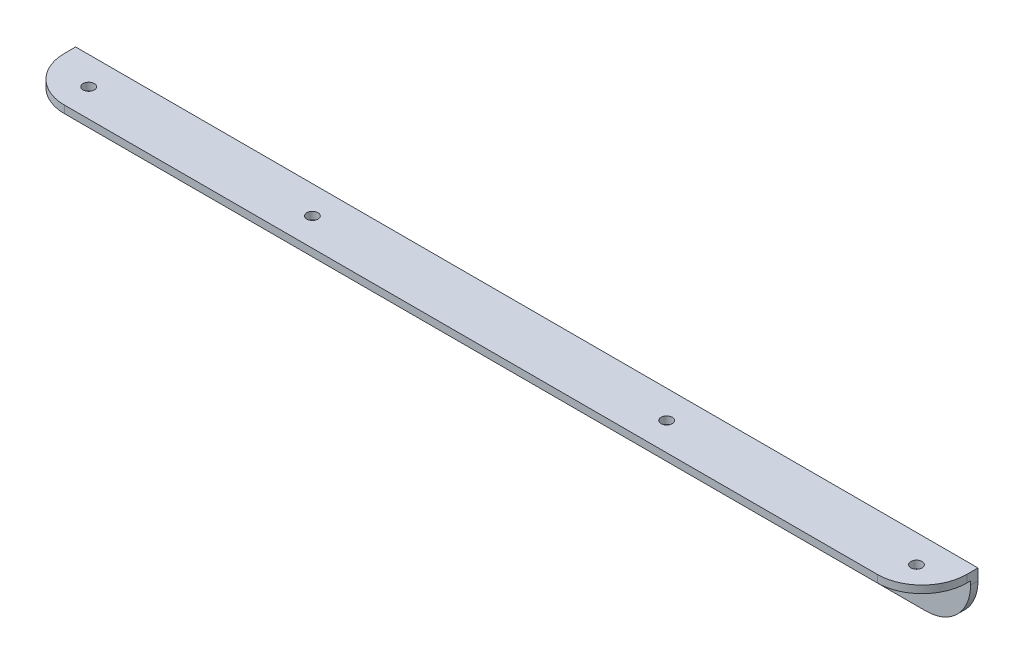
ISO-10303-21;
HEADER;
FILE_DESCRIPTION(('STEP AP214'),'2;1');
FILE_NAME('part.step','',(''),(''),'','','');
FILE_SCHEMA(('AUTOMOTIVE_DESIGN { 1 0 10303 214 1 1 1 1 }'));
ENDSEC;
DATA;
#1=APPLICATION_CONTEXT('core data for automotive mechanical design processes');
#2=APPLICATION_PROTOCOL_DEFINITION('international standard','automotive_design',2000,#1);
#3=PRODUCT_CONTEXT('',#1,'mechanical');
#4=PRODUCT('Part','Part','',(#3));
#5=PRODUCT_RELATED_PRODUCT_CATEGORY('part','',(#4));
#6=PRODUCT_DEFINITION_FORMATION('','',#4);
#7=PRODUCT_DEFINITION_CONTEXT('part definition',#1,'design');
#8=PRODUCT_DEFINITION('design','',#6,#7);
#9=PRODUCT_DEFINITION_SHAPE('','',#8);
#10=(LENGTH_UNIT() NAMED_UNIT(*) SI_UNIT(.MILLI.,.METRE.));
#11=(NAMED_UNIT(*) PLANE_ANGLE_UNIT() SI_UNIT($,.RADIAN.));
#12=(NAMED_UNIT(*) SI_UNIT($,.STERADIAN.) SOLID_ANGLE_UNIT());
#13=UNCERTAINTY_MEASURE_WITH_UNIT(LENGTH_MEASURE(1.E-05),#10,'distance_accuracy_value','');
#14=(GEOMETRIC_REPRESENTATION_CONTEXT(3) GLOBAL_UNCERTAINTY_ASSIGNED_CONTEXT((#13)) GLOBAL_UNIT_ASSIGNED_CONTEXT((#10,
#11,#12)) REPRESENTATION_CONTEXT('',''));
#15=CARTESIAN_POINT('',(0.,0.,0.));
#16=DIRECTION('',(0.,0.,1.));
#17=DIRECTION('',(1.,0.,0.));
#18=AXIS2_PLACEMENT_3D('',#15,#16,#17);
#19=CARTESIAN_POINT('',(-121.,-13.,2.));
#20=DIRECTION('',(0.,1.,0.));
#21=DIRECTION('',(-1.,0.,0.));
#22=AXIS2_PLACEMENT_3D('',#19,#20,#21);
#23=PLANE('',#22);
#24=DIRECTION('',(1.,0.,0.));
#25=VECTOR('',#24,1.);
#26=CARTESIAN_POINT('',(-121.,-13.,2.));
#27=LINE('',#26,#25);
#28=CARTESIAN_POINT('',(-109.,-13.,2.));
#29=VERTEX_POINT('',#28);
#30=CARTESIAN_POINT('',(-18.,-13.,2.));
#31=VERTEX_POINT('',#30);
#32=EDGE_CURVE('E247',#29,#31,#27,.T.);
#33=ORIENTED_EDGE('',*,*,#32,.F.);
#34=DIRECTION('',(0.,0.,-1.));
#35=VECTOR('',#34,1.);
#36=CARTESIAN_POINT('',(-109.,-13.,2.));
#37=LINE('',#36,#35);
#38=CARTESIAN_POINT('',(-109.,-13.,0.));
#39=VERTEX_POINT('',#38);
#40=EDGE_CURVE('E248',#29,#39,#37,.T.);
#41=ORIENTED_EDGE('',*,*,#40,.T.);
#42=DIRECTION('',(1.,0.,0.));
#43=VECTOR('',#42,1.);
#44=CARTESIAN_POINT('',(-121.,-13.,0.));
#45=LINE('',#44,#43);
#46=CARTESIAN_POINT('',(-18.,-13.,0.));
#47=VERTEX_POINT('',#46);
#48=EDGE_CURVE('E240',#39,#47,#45,.T.);
#49=ORIENTED_EDGE('',*,*,#48,.T.);
#50=DIRECTION('',(0.,0.,1.));
#51=VECTOR('',#50,1.);
#52=CARTESIAN_POINT('',(-18.,-13.,-0.00100000000000013));
#53=LINE('',#52,#51);
#54=EDGE_CURVE('E197',#47,#31,#53,.T.);
#55=ORIENTED_EDGE('',*,*,#54,.T.);
#56=EDGE_LOOP('',(#33,#41,#49,#55));
#57=FACE_BOUND('',#56,.T.);
#58=ADVANCED_FACE('F39',(#57),#23,.F.);
#59=CARTESIAN_POINT('',(0.,0.,2.));
#60=DIRECTION('',(0.,0.,1.));
#61=DIRECTION('',(1.,0.,0.));
#62=AXIS2_PLACEMENT_3D('',#59,#60,#61);
#63=PLANE('',#62);
#64=DIRECTION('',(0.,-1.,0.));
#65=VECTOR('',#64,1.);
#66=CARTESIAN_POINT('',(-121.,0.,2.));
#67=LINE('',#66,#65);
#68=CARTESIAN_POINT('',(-121.,0.,2.));
#69=VERTEX_POINT('',#68);
#70=CARTESIAN_POINT('',(-121.,-0.999999999999997,2.));
#71=VERTEX_POINT('',#70);
#72=EDGE_CURVE('E243',#69,#71,#67,.T.);
#73=ORIENTED_EDGE('',*,*,#72,.T.);
#74=CARTESIAN_POINT('',(-109.,-0.999999999999997,2.));
#75=DIRECTION('',(0.,0.,1.));
#76=DIRECTION('',(1.,0.,0.));
#77=AXIS2_PLACEMENT_3D('',#74,#75,#76);
#78=CIRCLE('',#77,12.);
#79=EDGE_CURVE('E265',#71,#29,#78,.T.);
#80=ORIENTED_EDGE('',*,*,#79,.T.);
#81=ORIENTED_EDGE('',*,*,#32,.T.);
#82=DIRECTION('',(0.,-1.,0.));
#83=VECTOR('',#82,1.);
#84=CARTESIAN_POINT('',(-18.,-9.00000000000001,2.));
#85=LINE('',#84,#83);
#86=CARTESIAN_POINT('',(-18.,-9.00000000000001,2.));
#87=VERTEX_POINT('',#86);
#88=EDGE_CURVE('E193',#87,#31,#85,.T.);
#89=ORIENTED_EDGE('',*,*,#88,.F.);
#90=DIRECTION('',(-1.,0.,0.));
#91=VECTOR('',#90,1.);
#92=CARTESIAN_POINT('',(12.,-9.00000000000001,2.));
#93=LINE('',#92,#91);
#94=CARTESIAN_POINT('',(12.,-9.00000000000001,2.));
#95=VERTEX_POINT('',#94);
#96=EDGE_CURVE('E190',#95,#87,#93,.T.);
#97=ORIENTED_EDGE('',*,*,#96,.F.);
#98=DIRECTION('',(0.,1.,0.));
#99=VECTOR('',#98,1.);
#100=CARTESIAN_POINT('',(12.,-13.,2.));
#101=LINE('',#100,#99);
#102=CARTESIAN_POINT('',(12.,-13.,2.));
#103=VERTEX_POINT('',#102);
#104=EDGE_CURVE('E187',#103,#95,#101,.T.);
#105=ORIENTED_EDGE('',*,*,#104,.F.);
#106=CARTESIAN_POINT('',(109.,-13.,2.));
#107=VERTEX_POINT('',#106);
#108=EDGE_CURVE('E246',#103,#107,#27,.T.);
#109=ORIENTED_EDGE('',*,*,#108,.T.);
#110=CARTESIAN_POINT('',(109.,-0.999999999999956,2.));
#111=DIRECTION('',(0.,0.,1.));
#112=DIRECTION('',(1.,0.,0.));
#113=AXIS2_PLACEMENT_3D('',#110,#111,#112);
#114=CIRCLE('',#113,12.);
#115=CARTESIAN_POINT('',(121.,-0.999999999999943,2.));
#116=VERTEX_POINT('',#115);
#117=EDGE_CURVE('E263',#107,#116,#114,.T.);
#118=ORIENTED_EDGE('',*,*,#117,.T.);
#119=DIRECTION('',(0.,1.,0.));
#120=VECTOR('',#119,1.);
#121=CARTESIAN_POINT('',(121.,0.,2.));
#122=LINE('',#121,#120);
#123=CARTESIAN_POINT('',(121.,0.,2.));
#124=VERTEX_POINT('',#123);
#125=EDGE_CURVE('E236',#116,#124,#122,.T.);
#126=ORIENTED_EDGE('',*,*,#125,.T.);
#127=DIRECTION('',(-1.,0.,0.));
#128=VECTOR('',#127,1.);
#129=CARTESIAN_POINT('',(-121.,0.,2.));
#130=LINE('',#129,#128);
#131=EDGE_CURVE('E239',#124,#69,#130,.T.);
#132=ORIENTED_EDGE('',*,*,#131,.T.);
#133=EDGE_LOOP('',(#73,#80,#81,#89,#97,#105,#109,#118,#126,#132));
#134=FACE_BOUND('',#133,.T.);
#135=CARTESIAN_POINT('',(27.,-6.5,2.));
#136=DIRECTION('',(0.,0.,1.));
#137=DIRECTION('',(1.,0.,0.));
#138=AXIS2_PLACEMENT_3D('',#135,#136,#137);
#139=CIRCLE('',#138,1.5);
#140=CARTESIAN_POINT('',(28.5,-6.5,2.));
#141=VERTEX_POINT('',#140);
#142=EDGE_CURVE('E214',#141,#141,#139,.T.);
#143=ORIENTED_EDGE('',*,*,#142,.F.);
#144=EDGE_LOOP('',(#143));
#145=FACE_BOUND('',#144,.T.);
#146=CARTESIAN_POINT('',(-44.,-6.5,2.));
#147=DIRECTION('',(0.,0.,1.));
#148=DIRECTION('',(1.,0.,0.));
#149=AXIS2_PLACEMENT_3D('',#146,#147,#148);
#150=CIRCLE('',#149,1.5);
#151=CARTESIAN_POINT('',(-42.5,-6.5,2.));
#152=VERTEX_POINT('',#151);
#153=EDGE_CURVE('E226',#152,#152,#150,.T.);
#154=ORIENTED_EDGE('',*,*,#153,.F.);
#155=EDGE_LOOP('',(#154));
#156=FACE_BOUND('',#155,.T.);
#157=CARTESIAN_POINT('',(-114.,-6.5,2.));
#158=DIRECTION('',(0.,0.,1.));
#159=DIRECTION('',(1.,0.,0.));
#160=AXIS2_PLACEMENT_3D('',#157,#158,#159);
#161=CIRCLE('',#160,1.5);
#162=CARTESIAN_POINT('',(-112.5,-6.5,2.));
#163=VERTEX_POINT('',#162);
#164=EDGE_CURVE('E159',#163,#163,#161,.T.);
#165=ORIENTED_EDGE('',*,*,#164,.F.);
#166=EDGE_LOOP('',(#165));
#167=FACE_BOUND('',#166,.T.);
#168=CARTESIAN_POINT('',(-24.,-6.5,2.));
#169=DIRECTION('',(0.,0.,1.));
#170=DIRECTION('',(1.,0.,0.));
#171=AXIS2_PLACEMENT_3D('',#168,#169,#170);
#172=CIRCLE('',#171,1.5);
#173=CARTESIAN_POINT('',(-22.5,-6.5,2.));
#174=VERTEX_POINT('',#173);
#175=EDGE_CURVE('E220',#174,#174,#172,.T.);
#176=ORIENTED_EDGE('',*,*,#175,.F.);
#177=EDGE_LOOP('',(#176));
#178=FACE_BOUND('',#177,.T.);
#179=CARTESIAN_POINT('',(97.,-6.5,2.));
#180=DIRECTION('',(0.,0.,1.));
#181=DIRECTION('',(1.,0.,0.));
#182=AXIS2_PLACEMENT_3D('',#179,#180,#181);
#183=CIRCLE('',#182,1.5);
#184=CARTESIAN_POINT('',(98.5,-6.5,2.));
#185=VERTEX_POINT('',#184);
#186=EDGE_CURVE('E208',#185,#185,#183,.T.);
#187=ORIENTED_EDGE('',*,*,#186,.F.);
#188=EDGE_LOOP('',(#187));
#189=FACE_BOUND('',#188,.T.);
#190=ADVANCED_FACE('F295',(#134,#145,#156,#167,#178,#189),#63,.T.);
#191=CARTESIAN_POINT('',(0.,0.,0.));
#192=DIRECTION('',(0.,0.,1.));
#193=DIRECTION('',(1.,0.,0.));
#194=AXIS2_PLACEMENT_3D('',#191,#192,#193);
#195=PLANE('',#194);
#196=ORIENTED_EDGE('',*,*,#48,.F.);
#197=CARTESIAN_POINT('',(-109.,-0.999999999999997,0.));
#198=DIRECTION('',(0.,0.,1.));
#199=DIRECTION('',(1.,0.,0.));
#200=AXIS2_PLACEMENT_3D('',#197,#198,#199);
#201=CIRCLE('',#200,12.);
#202=CARTESIAN_POINT('',(-121.,-0.999999999999997,0.));
#203=VERTEX_POINT('',#202);
#204=EDGE_CURVE('E257',#39,#203,#201,.F.);
#205=ORIENTED_EDGE('',*,*,#204,.T.);
#206=DIRECTION('',(0.,-1.,0.));
#207=VECTOR('',#206,1.);
#208=CARTESIAN_POINT('',(-121.,0.,0.));
#209=LINE('',#208,#207);
#210=CARTESIAN_POINT('',(-121.,2.00000000000004,0.));
#211=VERTEX_POINT('',#210);
#212=EDGE_CURVE('E158',#211,#203,#209,.T.);
#213=ORIENTED_EDGE('',*,*,#212,.F.);
#214=DIRECTION('',(-1.,0.,0.));
#215=VECTOR('',#214,1.);
#216=CARTESIAN_POINT('',(-121.,2.00000000000004,0.));
#217=LINE('',#216,#215);
#218=CARTESIAN_POINT('',(121.,2.00000000000004,0.));
#219=VERTEX_POINT('',#218);
#220=EDGE_CURVE('E145',#219,#211,#217,.T.);
#221=ORIENTED_EDGE('',*,*,#220,.F.);
#222=DIRECTION('',(0.,1.,0.));
#223=VECTOR('',#222,1.);
#224=CARTESIAN_POINT('',(121.,0.,0.));
#225=LINE('',#224,#223);
#226=CARTESIAN_POINT('',(121.,-0.999999999999943,0.));
#227=VERTEX_POINT('',#226);
#228=EDGE_CURVE('E152',#227,#219,#225,.T.);
#229=ORIENTED_EDGE('',*,*,#228,.F.);
#230=CARTESIAN_POINT('',(109.,-0.999999999999956,0.));
#231=DIRECTION('',(0.,0.,1.));
#232=DIRECTION('',(1.,0.,0.));
#233=AXIS2_PLACEMENT_3D('',#230,#231,#232);
#234=CIRCLE('',#233,12.);
#235=CARTESIAN_POINT('',(109.,-13.,0.));
#236=VERTEX_POINT('',#235);
#237=EDGE_CURVE('E255',#227,#236,#234,.F.);
#238=ORIENTED_EDGE('',*,*,#237,.T.);
#239=CARTESIAN_POINT('',(12.,-13.,0.));
#240=VERTEX_POINT('',#239);
#241=EDGE_CURVE('E251',#240,#236,#45,.T.);
#242=ORIENTED_EDGE('',*,*,#241,.F.);
#243=DIRECTION('',(0.,-1.,0.));
#244=VECTOR('',#243,1.);
#245=CARTESIAN_POINT('',(12.,-13.,0.));
#246=LINE('',#245,#244);
#247=CARTESIAN_POINT('',(12.,-9.00000000000001,0.));
#248=VERTEX_POINT('',#247);
#249=EDGE_CURVE('E200',#248,#240,#246,.T.);
#250=ORIENTED_EDGE('',*,*,#249,.F.);
#251=DIRECTION('',(1.,0.,0.));
#252=VECTOR('',#251,1.);
#253=CARTESIAN_POINT('',(12.,-9.00000000000001,0.));
#254=LINE('',#253,#252);
#255=CARTESIAN_POINT('',(-18.,-9.00000000000001,0.));
#256=VERTEX_POINT('',#255);
#257=EDGE_CURVE('E181',#256,#248,#254,.T.);
#258=ORIENTED_EDGE('',*,*,#257,.F.);
#259=DIRECTION('',(0.,1.,0.));
#260=VECTOR('',#259,1.);
#261=CARTESIAN_POINT('',(-18.,-9.00000000000001,0.));
#262=LINE('',#261,#260);
#263=EDGE_CURVE('E184',#47,#256,#262,.T.);
#264=ORIENTED_EDGE('',*,*,#263,.F.);
#265=EDGE_LOOP('',(#196,#205,#213,#221,#229,#238,#242,#250,#258,#264));
#266=FACE_BOUND('',#265,.T.);
#267=CARTESIAN_POINT('',(-114.,-6.5,0.));
#268=DIRECTION('',(0.,0.,1.));
#269=DIRECTION('',(1.,0.,0.));
#270=AXIS2_PLACEMENT_3D('',#267,#268,#269);
#271=CIRCLE('',#270,1.5);
#272=CARTESIAN_POINT('',(-112.5,-6.5,0.));
#273=VERTEX_POINT('',#272);
#274=EDGE_CURVE('E229',#273,#273,#271,.T.);
#275=ORIENTED_EDGE('',*,*,#274,.T.);
#276=EDGE_LOOP('',(#275));
#277=FACE_BOUND('',#276,.T.);
#278=CARTESIAN_POINT('',(-44.,-6.5,0.));
#279=DIRECTION('',(0.,0.,1.));
#280=DIRECTION('',(1.,0.,0.));
#281=AXIS2_PLACEMENT_3D('',#278,#279,#280);
#282=CIRCLE('',#281,1.5);
#283=CARTESIAN_POINT('',(-42.5,-6.5,0.));
#284=VERTEX_POINT('',#283);
#285=EDGE_CURVE('E223',#284,#284,#282,.T.);
#286=ORIENTED_EDGE('',*,*,#285,.T.);
#287=EDGE_LOOP('',(#286));
#288=FACE_BOUND('',#287,.T.);
#289=CARTESIAN_POINT('',(-24.,-6.5,0.));
#290=DIRECTION('',(0.,0.,1.));
#291=DIRECTION('',(1.,0.,0.));
#292=AXIS2_PLACEMENT_3D('',#289,#290,#291);
#293=CIRCLE('',#292,1.5);
#294=CARTESIAN_POINT('',(-22.5,-6.5,0.));
#295=VERTEX_POINT('',#294);
#296=EDGE_CURVE('E217',#295,#295,#293,.T.);
#297=ORIENTED_EDGE('',*,*,#296,.T.);
#298=EDGE_LOOP('',(#297));
#299=FACE_BOUND('',#298,.T.);
#300=CARTESIAN_POINT('',(27.,-6.5,0.));
#301=DIRECTION('',(0.,0.,1.));
#302=DIRECTION('',(1.,0.,0.));
#303=AXIS2_PLACEMENT_3D('',#300,#301,#302);
#304=CIRCLE('',#303,1.5);
#305=CARTESIAN_POINT('',(28.5,-6.5,0.));
#306=VERTEX_POINT('',#305);
#307=EDGE_CURVE('E211',#306,#306,#304,.T.);
#308=ORIENTED_EDGE('',*,*,#307,.T.);
#309=EDGE_LOOP('',(#308));
#310=FACE_BOUND('',#309,.T.);
#311=CARTESIAN_POINT('',(97.,-6.5,0.));
#312=DIRECTION('',(0.,0.,1.));
#313=DIRECTION('',(1.,0.,0.));
#314=AXIS2_PLACEMENT_3D('',#311,#312,#313);
#315=CIRCLE('',#314,1.5);
#316=CARTESIAN_POINT('',(98.5,-6.5,0.));
#317=VERTEX_POINT('',#316);
#318=EDGE_CURVE('E207',#317,#317,#315,.T.);
#319=ORIENTED_EDGE('',*,*,#318,.T.);
#320=EDGE_LOOP('',(#319));
#321=FACE_BOUND('',#320,.T.);
#322=ADVANCED_FACE('F163',(#266,#277,#288,#299,#310,#321),#195,.F.);
#323=CARTESIAN_POINT('',(121.,0.,2.));
#324=DIRECTION('',(-1.,0.,0.));
#325=DIRECTION('',(0.,-1.,0.));
#326=AXIS2_PLACEMENT_3D('',#323,#324,#325);
#327=PLANE('',#326);
#328=ORIENTED_EDGE('',*,*,#125,.F.);
#329=DIRECTION('',(0.,0.,-1.));
#330=VECTOR('',#329,1.);
#331=CARTESIAN_POINT('',(121.,-0.999999999999943,2.));
#332=LINE('',#331,#330);
#333=EDGE_CURVE('E156',#116,#227,#332,.T.);
#334=ORIENTED_EDGE('',*,*,#333,.T.);
#335=ORIENTED_EDGE('',*,*,#228,.T.);
#336=DIRECTION('',(0.,0.,-1.));
#337=VECTOR('',#336,1.);
#338=CARTESIAN_POINT('',(121.,2.00000000000004,15.));
#339=LINE('',#338,#337);
#340=CARTESIAN_POINT('',(121.,2.00000000000004,3.));
#341=VERTEX_POINT('',#340);
#342=EDGE_CURVE('E141',#341,#219,#339,.T.);
#343=ORIENTED_EDGE('',*,*,#342,.F.);
#344=DIRECTION('',(0.,1.,0.));
#345=VECTOR('',#344,1.);
#346=CARTESIAN_POINT('',(121.,0.,3.));
#347=LINE('',#346,#345);
#348=CARTESIAN_POINT('',(121.,0.,3.));
#349=VERTEX_POINT('',#348);
#350=EDGE_CURVE('E267',#341,#349,#347,.F.);
#351=ORIENTED_EDGE('',*,*,#350,.T.);
#352=DIRECTION('',(0.,0.,-1.));
#353=VECTOR('',#352,1.);
#354=CARTESIAN_POINT('',(121.,0.,15.));
#355=LINE('',#354,#353);
#356=EDGE_CURVE('E147',#349,#124,#355,.T.);
#357=ORIENTED_EDGE('',*,*,#356,.T.);
#358=EDGE_LOOP('',(#328,#334,#335,#343,#351,#357));
#359=FACE_BOUND('',#358,.T.);
#360=ADVANCED_FACE('F154',(#359),#327,.F.);
#361=CARTESIAN_POINT('',(-121.,0.,2.));
#362=DIRECTION('',(1.,0.,0.));
#363=DIRECTION('',(0.,0.,-1.));
#364=AXIS2_PLACEMENT_3D('',#361,#362,#363);
#365=PLANE('',#364);
#366=ORIENTED_EDGE('',*,*,#212,.T.);
#367=DIRECTION('',(0.,0.,-1.));
#368=VECTOR('',#367,1.);
#369=CARTESIAN_POINT('',(-121.,-0.999999999999997,2.));
#370=LINE('',#369,#368);
#371=EDGE_CURVE('E261',#203,#71,#370,.F.);
#372=ORIENTED_EDGE('',*,*,#371,.T.);
#373=ORIENTED_EDGE('',*,*,#72,.F.);
#374=DIRECTION('',(0.,0.,-1.));
#375=VECTOR('',#374,1.);
#376=CARTESIAN_POINT('',(-121.,0.,15.));
#377=LINE('',#376,#375);
#378=CARTESIAN_POINT('',(-121.,0.,3.));
#379=VERTEX_POINT('',#378);
#380=EDGE_CURVE('E179',#379,#69,#377,.T.);
#381=ORIENTED_EDGE('',*,*,#380,.F.);
#382=DIRECTION('',(0.,-1.,0.));
#383=VECTOR('',#382,1.);
#384=CARTESIAN_POINT('',(-121.,0.,3.));
#385=LINE('',#384,#383);
#386=CARTESIAN_POINT('',(-121.,2.00000000000004,3.));
#387=VERTEX_POINT('',#386);
#388=EDGE_CURVE('E259',#379,#387,#385,.F.);
#389=ORIENTED_EDGE('',*,*,#388,.T.);
#390=DIRECTION('',(0.,0.,-1.));
#391=VECTOR('',#390,1.);
#392=CARTESIAN_POINT('',(-121.,2.00000000000004,15.));
#393=LINE('',#392,#391);
#394=EDGE_CURVE('E148',#387,#211,#393,.T.);
#395=ORIENTED_EDGE('',*,*,#394,.T.);
#396=EDGE_LOOP('',(#366,#372,#373,#381,#389,#395));
#397=FACE_BOUND('',#396,.T.);
#398=ADVANCED_FACE('F289',(#397),#365,.F.);
#399=ORIENTED_EDGE('',*,*,#241,.T.);
#400=DIRECTION('',(0.,0.,-1.));
#401=VECTOR('',#400,1.);
#402=CARTESIAN_POINT('',(109.,-13.,2.));
#403=LINE('',#402,#401);
#404=EDGE_CURVE('E270',#236,#107,#403,.F.);
#405=ORIENTED_EDGE('',*,*,#404,.T.);
#406=ORIENTED_EDGE('',*,*,#108,.F.);
#407=DIRECTION('',(0.,0.,1.));
#408=VECTOR('',#407,1.);
#409=CARTESIAN_POINT('',(12.,-13.,-0.00100000000000013));
#410=LINE('',#409,#408);
#411=EDGE_CURVE('E196',#240,#103,#410,.T.);
#412=ORIENTED_EDGE('',*,*,#411,.F.);
#413=EDGE_LOOP('',(#399,#405,#406,#412));
#414=FACE_BOUND('',#413,.T.);
#415=ADVANCED_FACE('F309',(#414),#23,.F.);
#416=CARTESIAN_POINT('',(-114.,-6.5,2.));
#417=DIRECTION('',(0.,0.,-1.));
#418=DIRECTION('',(-1.,0.,0.));
#419=AXIS2_PLACEMENT_3D('',#416,#417,#418);
#420=CYLINDRICAL_SURFACE('',#419,1.5);
#421=ORIENTED_EDGE('',*,*,#164,.T.);
#422=EDGE_LOOP('',(#421));
#423=FACE_BOUND('',#422,.T.);
#424=ORIENTED_EDGE('',*,*,#274,.F.);
#425=EDGE_LOOP('',(#424));
#426=FACE_BOUND('',#425,.T.);
#427=ADVANCED_FACE('F350',(#423,#426),#420,.F.);
#428=CARTESIAN_POINT('',(-44.,-6.5,2.));
#429=DIRECTION('',(0.,0.,-1.));
#430=DIRECTION('',(-1.,0.,0.));
#431=AXIS2_PLACEMENT_3D('',#428,#429,#430);
#432=CYLINDRICAL_SURFACE('',#431,1.5);
#433=ORIENTED_EDGE('',*,*,#153,.T.);
#434=EDGE_LOOP('',(#433));
#435=FACE_BOUND('',#434,.T.);
#436=ORIENTED_EDGE('',*,*,#285,.F.);
#437=EDGE_LOOP('',(#436));
#438=FACE_BOUND('',#437,.T.);
#439=ADVANCED_FACE('F356',(#435,#438),#432,.F.);
#440=CARTESIAN_POINT('',(-24.,-6.5,2.));
#441=DIRECTION('',(0.,0.,-1.));
#442=DIRECTION('',(-1.,0.,0.));
#443=AXIS2_PLACEMENT_3D('',#440,#441,#442);
#444=CYLINDRICAL_SURFACE('',#443,1.5);
#445=ORIENTED_EDGE('',*,*,#175,.T.);
#446=EDGE_LOOP('',(#445));
#447=FACE_BOUND('',#446,.T.);
#448=ORIENTED_EDGE('',*,*,#296,.F.);
#449=EDGE_LOOP('',(#448));
#450=FACE_BOUND('',#449,.T.);
#451=ADVANCED_FACE('F370',(#447,#450),#444,.F.);
#452=CARTESIAN_POINT('',(27.,-6.5,2.));
#453=DIRECTION('',(0.,0.,-1.));
#454=DIRECTION('',(-1.,0.,0.));
#455=AXIS2_PLACEMENT_3D('',#452,#453,#454);
#456=CYLINDRICAL_SURFACE('',#455,1.5);
#457=ORIENTED_EDGE('',*,*,#142,.T.);
#458=EDGE_LOOP('',(#457));
#459=FACE_BOUND('',#458,.T.);
#460=ORIENTED_EDGE('',*,*,#307,.F.);
#461=EDGE_LOOP('',(#460));
#462=FACE_BOUND('',#461,.T.);
#463=ADVANCED_FACE('F374',(#459,#462),#456,.F.);
#464=CARTESIAN_POINT('',(97.,-6.5,2.));
#465=DIRECTION('',(0.,0.,-1.));
#466=DIRECTION('',(-1.,0.,0.));
#467=AXIS2_PLACEMENT_3D('',#464,#465,#466);
#468=CYLINDRICAL_SURFACE('',#467,1.5);
#469=ORIENTED_EDGE('',*,*,#186,.T.);
#470=EDGE_LOOP('',(#469));
#471=FACE_BOUND('',#470,.T.);
#472=ORIENTED_EDGE('',*,*,#318,.F.);
#473=EDGE_LOOP('',(#472));
#474=FACE_BOUND('',#473,.T.);
#475=ADVANCED_FACE('F378',(#471,#474),#468,.F.);
#476=CARTESIAN_POINT('',(-18.,-9.00000000000001,-0.00100000000000013));
#477=DIRECTION('',(-1.,0.,0.));
#478=DIRECTION('',(0.,0.,1.));
#479=AXIS2_PLACEMENT_3D('',#476,#477,#478);
#480=PLANE('',#479);
#481=ORIENTED_EDGE('',*,*,#263,.T.);
#482=DIRECTION('',(0.,0.,1.));
#483=VECTOR('',#482,1.);
#484=CARTESIAN_POINT('',(-18.,-9.00000000000001,-0.00100000000000013));
#485=LINE('',#484,#483);
#486=EDGE_CURVE('E201',#256,#87,#485,.T.);
#487=ORIENTED_EDGE('',*,*,#486,.T.);
#488=ORIENTED_EDGE('',*,*,#88,.T.);
#489=ORIENTED_EDGE('',*,*,#54,.F.);
#490=EDGE_LOOP('',(#481,#487,#488,#489));
#491=FACE_BOUND('',#490,.T.);
#492=ADVANCED_FACE('F320',(#491),#480,.F.);
#493=CARTESIAN_POINT('',(12.,-9.00000000000001,-0.00100000000000013));
#494=DIRECTION('',(0.,1.,0.));
#495=DIRECTION('',(-1.,0.,0.));
#496=AXIS2_PLACEMENT_3D('',#493,#494,#495);
#497=PLANE('',#496);
#498=ORIENTED_EDGE('',*,*,#257,.T.);
#499=DIRECTION('',(0.,0.,1.));
#500=VECTOR('',#499,1.);
#501=CARTESIAN_POINT('',(12.,-9.00000000000001,-0.00100000000000013));
#502=LINE('',#501,#500);
#503=EDGE_CURVE('E203',#248,#95,#502,.T.);
#504=ORIENTED_EDGE('',*,*,#503,.T.);
#505=ORIENTED_EDGE('',*,*,#96,.T.);
#506=ORIENTED_EDGE('',*,*,#486,.F.);
#507=EDGE_LOOP('',(#498,#504,#505,#506));
#508=FACE_BOUND('',#507,.T.);
#509=ADVANCED_FACE('F315',(#508),#497,.F.);
#510=CARTESIAN_POINT('',(12.,-13.,-0.00100000000000013));
#511=DIRECTION('',(1.,0.,0.));
#512=DIRECTION('',(0.,0.,-1.));
#513=AXIS2_PLACEMENT_3D('',#510,#511,#512);
#514=PLANE('',#513);
#515=ORIENTED_EDGE('',*,*,#249,.T.);
#516=ORIENTED_EDGE('',*,*,#411,.T.);
#517=ORIENTED_EDGE('',*,*,#104,.T.);
#518=ORIENTED_EDGE('',*,*,#503,.F.);
#519=EDGE_LOOP('',(#515,#516,#517,#518));
#520=FACE_BOUND('',#519,.T.);
#521=ADVANCED_FACE('F311',(#520),#514,.F.);
#522=CARTESIAN_POINT('',(-121.,0.,15.));
#523=DIRECTION('',(0.,1.,0.));
#524=DIRECTION('',(-1.,0.,0.));
#525=AXIS2_PLACEMENT_3D('',#522,#523,#524);
#526=PLANE('',#525);
#527=CARTESIAN_POINT('',(-110.,0.,7.5));
#528=DIRECTION('',(0.,1.,0.));
#529=DIRECTION('',(-1.,0.,0.));
#530=AXIS2_PLACEMENT_3D('',#527,#528,#529);
#531=CIRCLE('',#530,1.5);
#532=CARTESIAN_POINT('',(-111.5,0.,7.5));
#533=VERTEX_POINT('',#532);
#534=EDGE_CURVE('E167',#533,#533,#531,.F.);
#535=ORIENTED_EDGE('',*,*,#534,.F.);
#536=EDGE_LOOP('',(#535));
#537=FACE_BOUND('',#536,.T.);
#538=CARTESIAN_POINT('',(-50.,0.,7.5));
#539=DIRECTION('',(0.,1.,0.));
#540=DIRECTION('',(-1.,0.,0.));
#541=AXIS2_PLACEMENT_3D('',#538,#539,#540);
#542=CIRCLE('',#541,1.5);
#543=CARTESIAN_POINT('',(-51.5,0.,7.5));
#544=VERTEX_POINT('',#543);
#545=EDGE_CURVE('E413',#544,#544,#542,.F.);
#546=ORIENTED_EDGE('',*,*,#545,.F.);
#547=EDGE_LOOP('',(#546));
#548=FACE_BOUND('',#547,.T.);
#549=CARTESIAN_POINT('',(45.,0.,7.5));
#550=DIRECTION('',(0.,1.,0.));
#551=DIRECTION('',(-1.,0.,0.));
#552=AXIS2_PLACEMENT_3D('',#549,#550,#551);
#553=CIRCLE('',#552,1.5);
#554=CARTESIAN_POINT('',(43.5,0.,7.5));
#555=VERTEX_POINT('',#554);
#556=EDGE_CURVE('E419',#555,#555,#553,.F.);
#557=ORIENTED_EDGE('',*,*,#556,.F.);
#558=EDGE_LOOP('',(#557));
#559=FACE_BOUND('',#558,.T.);
#560=CARTESIAN_POINT('',(112.,0.,7.5));
#561=DIRECTION('',(0.,1.,0.));
#562=DIRECTION('',(-1.,0.,0.));
#563=AXIS2_PLACEMENT_3D('',#560,#561,#562);
#564=CIRCLE('',#563,1.5);
#565=CARTESIAN_POINT('',(110.5,0.,7.5));
#566=VERTEX_POINT('',#565);
#567=EDGE_CURVE('E426',#566,#566,#564,.F.);
#568=ORIENTED_EDGE('',*,*,#567,.F.);
#569=EDGE_LOOP('',(#568));
#570=FACE_BOUND('',#569,.T.);
#571=ORIENTED_EDGE('',*,*,#356,.F.);
#572=CARTESIAN_POINT('',(109.,0.,3.));
#573=DIRECTION('',(0.,1.,0.));
#574=DIRECTION('',(-1.,0.,0.));
#575=AXIS2_PLACEMENT_3D('',#572,#573,#574);
#576=CIRCLE('',#575,12.);
#577=CARTESIAN_POINT('',(109.,0.,15.));
#578=VERTEX_POINT('',#577);
#579=EDGE_CURVE('E11',#349,#578,#576,.F.);
#580=ORIENTED_EDGE('',*,*,#579,.T.);
#581=DIRECTION('',(1.,0.,0.));
#582=VECTOR('',#581,1.);
#583=CARTESIAN_POINT('',(-121.,0.,15.));
#584=LINE('',#583,#582);
#585=CARTESIAN_POINT('',(-109.,0.,15.));
#586=VERTEX_POINT('',#585);
#587=EDGE_CURVE('E166',#586,#578,#584,.T.);
#588=ORIENTED_EDGE('',*,*,#587,.F.);
#589=CARTESIAN_POINT('',(-109.,0.,3.));
#590=DIRECTION('',(0.,1.,0.));
#591=DIRECTION('',(-1.,0.,0.));
#592=AXIS2_PLACEMENT_3D('',#589,#590,#591);
#593=CIRCLE('',#592,12.);
#594=EDGE_CURVE('E47',#586,#379,#593,.F.);
#595=ORIENTED_EDGE('',*,*,#594,.T.);
#596=ORIENTED_EDGE('',*,*,#380,.T.);
#597=ORIENTED_EDGE('',*,*,#131,.F.);
#598=EDGE_LOOP('',(#571,#580,#588,#595,#596,#597));
#599=FACE_BOUND('',#598,.T.);
#600=ADVANCED_FACE('F282',(#537,#548,#559,#570,#599),#526,.F.);
#601=CARTESIAN_POINT('',(-121.,2.00000000000004,15.));
#602=DIRECTION('',(0.,-1.,0.));
#603=DIRECTION('',(0.,0.,-1.));
#604=AXIS2_PLACEMENT_3D('',#601,#602,#603);
#605=PLANE('',#604);
#606=CARTESIAN_POINT('',(-110.,2.00000000000004,7.5));
#607=DIRECTION('',(0.,1.,0.));
#608=DIRECTION('',(0.,0.,1.));
#609=AXIS2_PLACEMENT_3D('',#606,#607,#608);
#610=CIRCLE('',#609,1.5);
#611=CARTESIAN_POINT('',(-110.,2.00000000000004,9.));
#612=VERTEX_POINT('',#611);
#613=EDGE_CURVE('E173',#612,#612,#610,.T.);
#614=ORIENTED_EDGE('',*,*,#613,.F.);
#615=EDGE_LOOP('',(#614));
#616=FACE_BOUND('',#615,.T.);
#617=CARTESIAN_POINT('',(-50.,2.00000000000004,7.5));
#618=DIRECTION('',(0.,1.,0.));
#619=DIRECTION('',(0.,0.,1.));
#620=AXIS2_PLACEMENT_3D('',#617,#618,#619);
#621=CIRCLE('',#620,1.5);
#622=CARTESIAN_POINT('',(-50.,2.00000000000004,9.00000000000001));
#623=VERTEX_POINT('',#622);
#624=EDGE_CURVE('E410',#623,#623,#621,.T.);
#625=ORIENTED_EDGE('',*,*,#624,.F.);
#626=EDGE_LOOP('',(#625));
#627=FACE_BOUND('',#626,.T.);
#628=CARTESIAN_POINT('',(45.,2.00000000000004,7.5));
#629=DIRECTION('',(0.,1.,0.));
#630=DIRECTION('',(0.,0.,1.));
#631=AXIS2_PLACEMENT_3D('',#628,#629,#630);
#632=CIRCLE('',#631,1.5);
#633=CARTESIAN_POINT('',(45.,2.00000000000004,9.00000000000001));
#634=VERTEX_POINT('',#633);
#635=EDGE_CURVE('E415',#634,#634,#632,.T.);
#636=ORIENTED_EDGE('',*,*,#635,.F.);
#637=EDGE_LOOP('',(#636));
#638=FACE_BOUND('',#637,.T.);
#639=CARTESIAN_POINT('',(112.,2.00000000000004,7.5));
#640=DIRECTION('',(0.,1.,0.));
#641=DIRECTION('',(0.,0.,1.));
#642=AXIS2_PLACEMENT_3D('',#639,#640,#641);
#643=CIRCLE('',#642,1.5);
#644=CARTESIAN_POINT('',(112.,2.00000000000004,9.));
#645=VERTEX_POINT('',#644);
#646=EDGE_CURVE('E424',#645,#645,#643,.T.);
#647=ORIENTED_EDGE('',*,*,#646,.F.);
#648=EDGE_LOOP('',(#647));
#649=FACE_BOUND('',#648,.T.);
#650=DIRECTION('',(-1.,0.,0.));
#651=VECTOR('',#650,1.);
#652=CARTESIAN_POINT('',(-121.,2.00000000000004,15.));
#653=LINE('',#652,#651);
#654=CARTESIAN_POINT('',(109.,2.00000000000004,15.));
#655=VERTEX_POINT('',#654);
#656=CARTESIAN_POINT('',(-109.,2.00000000000004,15.));
#657=VERTEX_POINT('',#656);
#658=EDGE_CURVE('E170',#655,#657,#653,.T.);
#659=ORIENTED_EDGE('',*,*,#658,.F.);
#660=CARTESIAN_POINT('',(109.,2.00000000000004,3.));
#661=DIRECTION('',(0.,-1.,0.));
#662=DIRECTION('',(0.,0.,-1.));
#663=AXIS2_PLACEMENT_3D('',#660,#661,#662);
#664=CIRCLE('',#663,12.);
#665=EDGE_CURVE('E62',#655,#341,#664,.F.);
#666=ORIENTED_EDGE('',*,*,#665,.T.);
#667=ORIENTED_EDGE('',*,*,#342,.T.);
#668=ORIENTED_EDGE('',*,*,#220,.T.);
#669=ORIENTED_EDGE('',*,*,#394,.F.);
#670=CARTESIAN_POINT('',(-109.,2.00000000000004,3.));
#671=DIRECTION('',(0.,-1.,0.));
#672=DIRECTION('',(0.,0.,-1.));
#673=AXIS2_PLACEMENT_3D('',#670,#671,#672);
#674=CIRCLE('',#673,12.);
#675=EDGE_CURVE('E54',#387,#657,#674,.F.);
#676=ORIENTED_EDGE('',*,*,#675,.T.);
#677=EDGE_LOOP('',(#659,#666,#667,#668,#669,#676));
#678=FACE_BOUND('',#677,.T.);
#679=ADVANCED_FACE('F143',(#616,#627,#638,#649,#678),#605,.F.);
#680=CARTESIAN_POINT('',(0.,0.,15.));
#681=DIRECTION('',(0.,0.,-1.));
#682=DIRECTION('',(-1.,0.,0.));
#683=AXIS2_PLACEMENT_3D('',#680,#681,#682);
#684=PLANE('',#683);
#685=ORIENTED_EDGE('',*,*,#587,.T.);
#686=DIRECTION('',(0.,1.,0.));
#687=VECTOR('',#686,1.);
#688=CARTESIAN_POINT('',(109.,1.16359913157829E-13,15.));
#689=LINE('',#688,#687);
#690=EDGE_CURVE('E275',#578,#655,#689,.T.);
#691=ORIENTED_EDGE('',*,*,#690,.T.);
#692=ORIENTED_EDGE('',*,*,#658,.T.);
#693=DIRECTION('',(0.,-1.,0.));
#694=VECTOR('',#693,1.);
#695=CARTESIAN_POINT('',(-109.,0.,15.));
#696=LINE('',#695,#694);
#697=EDGE_CURVE('E272',#657,#586,#696,.T.);
#698=ORIENTED_EDGE('',*,*,#697,.T.);
#699=EDGE_LOOP('',(#685,#691,#692,#698));
#700=FACE_BOUND('',#699,.T.);
#701=ADVANCED_FACE('F291',(#700),#684,.F.);
#702=CARTESIAN_POINT('',(112.,-13.001,7.5));
#703=DIRECTION('',(0.,1.,0.));
#704=DIRECTION('',(0.,0.,1.));
#705=AXIS2_PLACEMENT_3D('',#702,#703,#704);
#706=CYLINDRICAL_SURFACE('',#705,1.5);
#707=ORIENTED_EDGE('',*,*,#646,.T.);
#708=EDGE_LOOP('',(#707));
#709=FACE_BOUND('',#708,.T.);
#710=ORIENTED_EDGE('',*,*,#567,.T.);
#711=EDGE_LOOP('',(#710));
#712=FACE_BOUND('',#711,.T.);
#713=ADVANCED_FACE('F395',(#709,#712),#706,.F.);
#714=CARTESIAN_POINT('',(45.,-13.001,7.5));
#715=DIRECTION('',(0.,1.,0.));
#716=DIRECTION('',(0.,0.,1.));
#717=AXIS2_PLACEMENT_3D('',#714,#715,#716);
#718=CYLINDRICAL_SURFACE('',#717,1.5);
#719=ORIENTED_EDGE('',*,*,#635,.T.);
#720=EDGE_LOOP('',(#719));
#721=FACE_BOUND('',#720,.T.);
#722=ORIENTED_EDGE('',*,*,#556,.T.);
#723=EDGE_LOOP('',(#722));
#724=FACE_BOUND('',#723,.T.);
#725=ADVANCED_FACE('F398',(#721,#724),#718,.F.);
#726=CARTESIAN_POINT('',(-50.,-13.001,7.5));
#727=DIRECTION('',(0.,1.,0.));
#728=DIRECTION('',(0.,0.,1.));
#729=AXIS2_PLACEMENT_3D('',#726,#727,#728);
#730=CYLINDRICAL_SURFACE('',#729,1.5);
#731=ORIENTED_EDGE('',*,*,#624,.T.);
#732=EDGE_LOOP('',(#731));
#733=FACE_BOUND('',#732,.T.);
#734=ORIENTED_EDGE('',*,*,#545,.T.);
#735=EDGE_LOOP('',(#734));
#736=FACE_BOUND('',#735,.T.);
#737=ADVANCED_FACE('F337',(#733,#736),#730,.F.);
#738=CARTESIAN_POINT('',(-110.,-13.001,7.5));
#739=DIRECTION('',(0.,1.,0.));
#740=DIRECTION('',(0.,0.,1.));
#741=AXIS2_PLACEMENT_3D('',#738,#739,#740);
#742=CYLINDRICAL_SURFACE('',#741,1.5);
#743=ORIENTED_EDGE('',*,*,#613,.T.);
#744=EDGE_LOOP('',(#743));
#745=FACE_BOUND('',#744,.T.);
#746=ORIENTED_EDGE('',*,*,#534,.T.);
#747=EDGE_LOOP('',(#746));
#748=FACE_BOUND('',#747,.T.);
#749=ADVANCED_FACE('F329',(#745,#748),#742,.F.);
#750=CARTESIAN_POINT('',(-109.,-0.999999999999997,2.));
#751=DIRECTION('',(0.,0.,-1.));
#752=DIRECTION('',(-1.,0.,0.));
#753=AXIS2_PLACEMENT_3D('',#750,#751,#752);
#754=CYLINDRICAL_SURFACE('',#753,12.);
#755=ORIENTED_EDGE('',*,*,#79,.F.);
#756=ORIENTED_EDGE('',*,*,#371,.F.);
#757=ORIENTED_EDGE('',*,*,#204,.F.);
#758=ORIENTED_EDGE('',*,*,#40,.F.);
#759=EDGE_LOOP('',(#755,#756,#757,#758));
#760=FACE_BOUND('',#759,.T.);
#761=ADVANCED_FACE('F326',(#760),#754,.T.);
#762=CARTESIAN_POINT('',(109.,-0.999999999999956,2.));
#763=DIRECTION('',(0.,0.,-1.));
#764=DIRECTION('',(-1.,0.,0.));
#765=AXIS2_PLACEMENT_3D('',#762,#763,#764);
#766=CYLINDRICAL_SURFACE('',#765,12.);
#767=ORIENTED_EDGE('',*,*,#117,.F.);
#768=ORIENTED_EDGE('',*,*,#404,.F.);
#769=ORIENTED_EDGE('',*,*,#237,.F.);
#770=ORIENTED_EDGE('',*,*,#333,.F.);
#771=EDGE_LOOP('',(#767,#768,#769,#770));
#772=FACE_BOUND('',#771,.T.);
#773=ADVANCED_FACE('F303',(#772),#766,.T.);
#774=CARTESIAN_POINT('',(109.,1.16359913157829E-13,3.));
#775=DIRECTION('',(0.,1.,0.));
#776=DIRECTION('',(-1.,0.,0.));
#777=AXIS2_PLACEMENT_3D('',#774,#775,#776);
#778=CYLINDRICAL_SURFACE('',#777,12.);
#779=ORIENTED_EDGE('',*,*,#579,.F.);
#780=ORIENTED_EDGE('',*,*,#350,.F.);
#781=ORIENTED_EDGE('',*,*,#665,.F.);
#782=ORIENTED_EDGE('',*,*,#690,.F.);
#783=EDGE_LOOP('',(#779,#780,#781,#782));
#784=FACE_BOUND('',#783,.T.);
#785=ADVANCED_FACE('F293',(#784),#778,.T.);
#786=CARTESIAN_POINT('',(-109.,0.,3.));
#787=DIRECTION('',(0.,-1.,0.));
#788=DIRECTION('',(0.,0.,-1.));
#789=AXIS2_PLACEMENT_3D('',#786,#787,#788);
#790=CYLINDRICAL_SURFACE('',#789,12.);
#791=ORIENTED_EDGE('',*,*,#675,.F.);
#792=ORIENTED_EDGE('',*,*,#388,.F.);
#793=ORIENTED_EDGE('',*,*,#594,.F.);
#794=ORIENTED_EDGE('',*,*,#697,.F.);
#795=EDGE_LOOP('',(#791,#792,#793,#794));
#796=FACE_BOUND('',#795,.T.);
#797=ADVANCED_FACE('F41',(#796),#790,.T.);
#798=CLOSED_SHELL('',(#58,#190,#322,#360,#398,#415,#427,#439,#451,#463,#475,#492,#509,#521,#600,
#679,#701,#713,#725,#737,#749,#761,#773,#785,#797));
#799=MANIFOLD_SOLID_BREP('B2',#798);
#800=ADVANCED_BREP_SHAPE_REPRESENTATION('',(#18,#799),#14);
#801=SHAPE_DEFINITION_REPRESENTATION(#9,#800);
ENDSEC;
END-ISO-10303-21;
